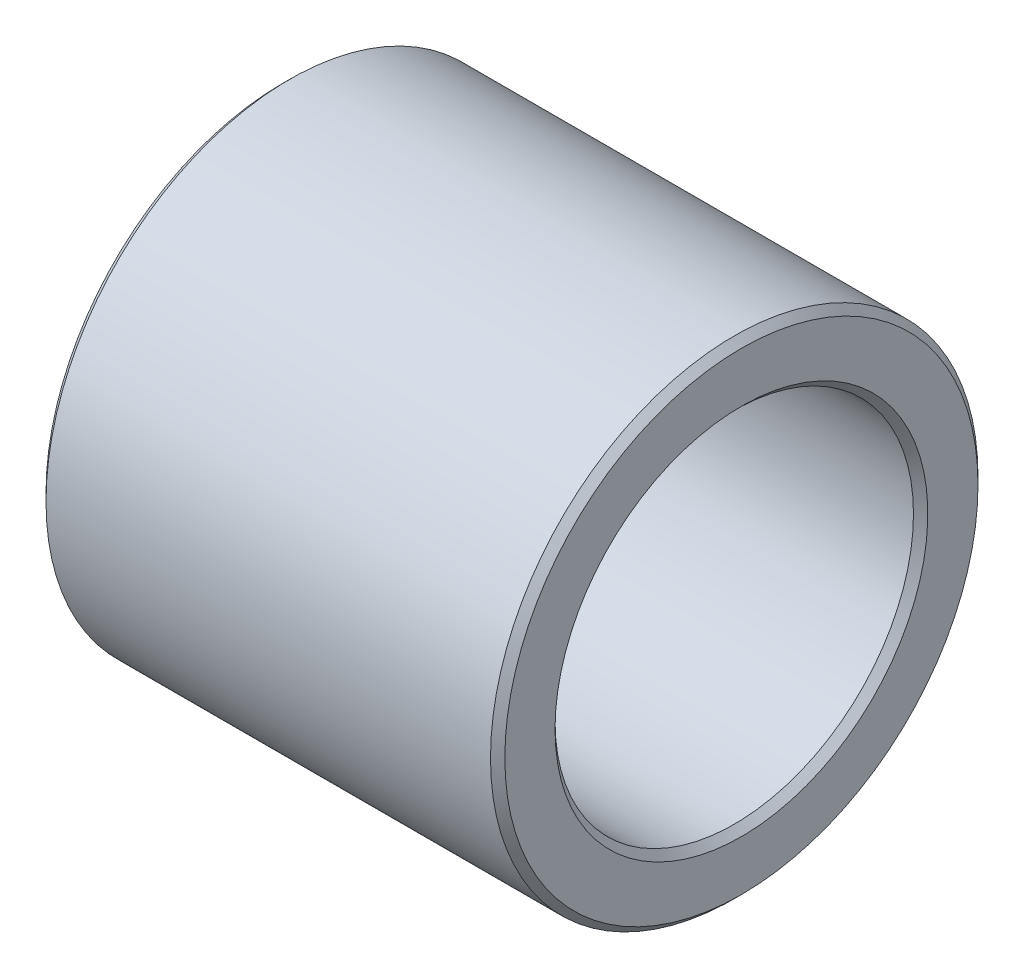
ISO-10303-21;
HEADER;
FILE_DESCRIPTION(('STEP AP214'),'2;1');
FILE_NAME('part.step','',(''),(''),'','','');
FILE_SCHEMA(('AUTOMOTIVE_DESIGN { 1 0 10303 214 1 1 1 1 }'));
ENDSEC;
DATA;
#1=APPLICATION_CONTEXT('core data for automotive mechanical design processes');
#2=APPLICATION_PROTOCOL_DEFINITION('international standard','automotive_design',2000,#1);
#3=PRODUCT_CONTEXT('',#1,'mechanical');
#4=PRODUCT('Part','Part','',(#3));
#5=PRODUCT_RELATED_PRODUCT_CATEGORY('part','',(#4));
#6=PRODUCT_DEFINITION_FORMATION('','',#4);
#7=PRODUCT_DEFINITION_CONTEXT('part definition',#1,'design');
#8=PRODUCT_DEFINITION('design','',#6,#7);
#9=PRODUCT_DEFINITION_SHAPE('','',#8);
#10=(LENGTH_UNIT() NAMED_UNIT(*) SI_UNIT(.MILLI.,.METRE.));
#11=(NAMED_UNIT(*) PLANE_ANGLE_UNIT() SI_UNIT($,.RADIAN.));
#12=(NAMED_UNIT(*) SI_UNIT($,.STERADIAN.) SOLID_ANGLE_UNIT());
#13=UNCERTAINTY_MEASURE_WITH_UNIT(LENGTH_MEASURE(1.E-05),#10,'distance_accuracy_value','');
#14=(GEOMETRIC_REPRESENTATION_CONTEXT(3) GLOBAL_UNCERTAINTY_ASSIGNED_CONTEXT((#13)) GLOBAL_UNIT_ASSIGNED_CONTEXT((#10,
#11,#12)) REPRESENTATION_CONTEXT('',''));
#15=CARTESIAN_POINT('',(0.,0.,0.));
#16=DIRECTION('',(0.,0.,1.));
#17=DIRECTION('',(1.,0.,0.));
#18=AXIS2_PLACEMENT_3D('',#15,#16,#17);
#19=CARTESIAN_POINT('',(-16.,-17.,1.18710365520667E-13));
#20=DIRECTION('',(1.,0.,0.));
#21=DIRECTION('',(0.,0.,-1.));
#22=AXIS2_PLACEMENT_3D('',#19,#20,#21);
#23=PLANE('',#22);
#24=CARTESIAN_POINT('',(-16.,0.,0.));
#25=DIRECTION('',(1.,0.,0.));
#26=DIRECTION('',(0.,0.,-1.));
#27=AXIS2_PLACEMENT_3D('',#24,#25,#26);
#28=CIRCLE('',#27,13.);
#29=CARTESIAN_POINT('',(-16.,0.,-13.));
#30=VERTEX_POINT('',#29);
#31=EDGE_CURVE('E53',#30,#30,#28,.T.);
#32=ORIENTED_EDGE('',*,*,#31,.T.);
#33=EDGE_LOOP('',(#32));
#34=FACE_BOUND('',#33,.T.);
#35=CARTESIAN_POINT('',(-16.,0.,0.));
#36=DIRECTION('',(1.,0.,0.));
#37=DIRECTION('',(0.,0.,-1.));
#38=AXIS2_PLACEMENT_3D('',#35,#36,#37);
#39=CIRCLE('',#38,16.5);
#40=CARTESIAN_POINT('',(-16.,0.,-16.5));
#41=VERTEX_POINT('',#40);
#42=EDGE_CURVE('E56',#41,#41,#39,.F.);
#43=ORIENTED_EDGE('',*,*,#42,.T.);
#44=EDGE_LOOP('',(#43));
#45=FACE_BOUND('',#44,.T.);
#46=ADVANCED_FACE('F33',(#34,#45),#23,.F.);
#47=CARTESIAN_POINT('',(-15.2283606747402,0.,0.));
#48=DIRECTION('',(-1.,0.,0.));
#49=DIRECTION('',(0.,0.,1.));
#50=AXIS2_PLACEMENT_3D('',#47,#48,#49);
#51=CYLINDRICAL_SURFACE('',#50,12.5);
#52=CARTESIAN_POINT('',(-15.5,0.,0.));
#53=DIRECTION('',(1.,0.,0.));
#54=DIRECTION('',(0.,0.,-1.));
#55=AXIS2_PLACEMENT_3D('',#52,#53,#54);
#56=CIRCLE('',#55,12.5);
#57=CARTESIAN_POINT('',(-15.5,0.,-12.5));
#58=VERTEX_POINT('',#57);
#59=EDGE_CURVE('E59',#58,#58,#56,.F.);
#60=ORIENTED_EDGE('',*,*,#59,.T.);
#61=EDGE_LOOP('',(#60));
#62=FACE_BOUND('',#61,.T.);
#63=CARTESIAN_POINT('',(15.5,0.,0.));
#64=DIRECTION('',(-1.,0.,0.));
#65=DIRECTION('',(0.,0.,1.));
#66=AXIS2_PLACEMENT_3D('',#63,#64,#65);
#67=CIRCLE('',#66,12.5);
#68=CARTESIAN_POINT('',(15.5,0.,12.5));
#69=VERTEX_POINT('',#68);
#70=EDGE_CURVE('E62',#69,#69,#67,.F.);
#71=ORIENTED_EDGE('',*,*,#70,.T.);
#72=EDGE_LOOP('',(#71));
#73=FACE_BOUND('',#72,.T.);
#74=ADVANCED_FACE('F66',(#62,#73),#51,.F.);
#75=CARTESIAN_POINT('',(16.,-17.,1.18710365520667E-13));
#76=DIRECTION('',(-1.,0.,0.));
#77=DIRECTION('',(0.,0.,1.));
#78=AXIS2_PLACEMENT_3D('',#75,#76,#77);
#79=PLANE('',#78);
#80=CARTESIAN_POINT('',(16.,0.,0.));
#81=DIRECTION('',(-1.,0.,0.));
#82=DIRECTION('',(0.,0.,1.));
#83=AXIS2_PLACEMENT_3D('',#80,#81,#82);
#84=CIRCLE('',#83,16.5);
#85=CARTESIAN_POINT('',(16.,0.,16.5));
#86=VERTEX_POINT('',#85);
#87=EDGE_CURVE('E10',#86,#86,#84,.F.);
#88=ORIENTED_EDGE('',*,*,#87,.T.);
#89=EDGE_LOOP('',(#88));
#90=FACE_BOUND('',#89,.T.);
#91=CARTESIAN_POINT('',(16.,0.,0.));
#92=DIRECTION('',(-1.,0.,0.));
#93=DIRECTION('',(0.,0.,1.));
#94=AXIS2_PLACEMENT_3D('',#91,#92,#93);
#95=CIRCLE('',#94,13.);
#96=CARTESIAN_POINT('',(16.,0.,13.));
#97=VERTEX_POINT('',#96);
#98=EDGE_CURVE('E40',#97,#97,#95,.T.);
#99=ORIENTED_EDGE('',*,*,#98,.T.);
#100=EDGE_LOOP('',(#99));
#101=FACE_BOUND('',#100,.T.);
#102=ADVANCED_FACE('F82',(#90,#101),#79,.F.);
#103=CARTESIAN_POINT('',(-15.2283606747402,0.,0.));
#104=DIRECTION('',(-1.,0.,0.));
#105=DIRECTION('',(0.,0.,1.));
#106=AXIS2_PLACEMENT_3D('',#103,#104,#105);
#107=CYLINDRICAL_SURFACE('',#106,17.);
#108=CARTESIAN_POINT('',(-15.5,0.,0.));
#109=DIRECTION('',(1.,0.,0.));
#110=DIRECTION('',(0.,0.,-1.));
#111=AXIS2_PLACEMENT_3D('',#108,#109,#110);
#112=CIRCLE('',#111,17.);
#113=CARTESIAN_POINT('',(-15.5,0.,-17.));
#114=VERTEX_POINT('',#113);
#115=EDGE_CURVE('E44',#114,#114,#112,.T.);
#116=ORIENTED_EDGE('',*,*,#115,.T.);
#117=EDGE_LOOP('',(#116));
#118=FACE_BOUND('',#117,.T.);
#119=CARTESIAN_POINT('',(15.5,0.,0.));
#120=DIRECTION('',(-1.,0.,0.));
#121=DIRECTION('',(0.,0.,1.));
#122=AXIS2_PLACEMENT_3D('',#119,#120,#121);
#123=CIRCLE('',#122,17.);
#124=CARTESIAN_POINT('',(15.5,0.,17.));
#125=VERTEX_POINT('',#124);
#126=EDGE_CURVE('E48',#125,#125,#123,.T.);
#127=ORIENTED_EDGE('',*,*,#126,.T.);
#128=EDGE_LOOP('',(#127));
#129=FACE_BOUND('',#128,.T.);
#130=ADVANCED_FACE('F91',(#118,#129),#107,.T.);
#131=CARTESIAN_POINT('',(-15.5,0.,0.));
#132=DIRECTION('',(-1.,0.,0.));
#133=DIRECTION('',(0.,0.,1.));
#134=AXIS2_PLACEMENT_3D('',#131,#132,#133);
#135=CONICAL_SURFACE('',#134,12.5,0.785398163397457);
#136=ORIENTED_EDGE('',*,*,#31,.F.);
#137=EDGE_LOOP('',(#136));
#138=FACE_BOUND('',#137,.T.);
#139=ORIENTED_EDGE('',*,*,#59,.F.);
#140=EDGE_LOOP('',(#139));
#141=FACE_BOUND('',#140,.T.);
#142=ADVANCED_FACE('F88',(#138,#141),#135,.F.);
#143=CARTESIAN_POINT('',(-16.,0.,0.));
#144=DIRECTION('',(1.,0.,0.));
#145=DIRECTION('',(0.,0.,-1.));
#146=AXIS2_PLACEMENT_3D('',#143,#144,#145);
#147=CONICAL_SURFACE('',#146,16.5,0.785398163397441);
#148=ORIENTED_EDGE('',*,*,#115,.F.);
#149=EDGE_LOOP('',(#148));
#150=FACE_BOUND('',#149,.T.);
#151=ORIENTED_EDGE('',*,*,#42,.F.);
#152=EDGE_LOOP('',(#151));
#153=FACE_BOUND('',#152,.T.);
#154=ADVANCED_FACE('F74',(#150,#153),#147,.T.);
#155=CARTESIAN_POINT('',(15.5,0.,0.));
#156=DIRECTION('',(-1.,0.,0.));
#157=DIRECTION('',(0.,0.,1.));
#158=AXIS2_PLACEMENT_3D('',#155,#156,#157);
#159=CONICAL_SURFACE('',#158,17.,0.785398163397455);
#160=ORIENTED_EDGE('',*,*,#87,.F.);
#161=EDGE_LOOP('',(#160));
#162=FACE_BOUND('',#161,.T.);
#163=ORIENTED_EDGE('',*,*,#126,.F.);
#164=EDGE_LOOP('',(#163));
#165=FACE_BOUND('',#164,.T.);
#166=ADVANCED_FACE('F70',(#162,#165),#159,.T.);
#167=CARTESIAN_POINT('',(16.,0.,0.));
#168=DIRECTION('',(1.,0.,0.));
#169=DIRECTION('',(0.,0.,-1.));
#170=AXIS2_PLACEMENT_3D('',#167,#168,#169);
#171=CONICAL_SURFACE('',#170,13.,0.785398163397452);
#172=ORIENTED_EDGE('',*,*,#70,.F.);
#173=EDGE_LOOP('',(#172));
#174=FACE_BOUND('',#173,.T.);
#175=ORIENTED_EDGE('',*,*,#98,.F.);
#176=EDGE_LOOP('',(#175));
#177=FACE_BOUND('',#176,.T.);
#178=ADVANCED_FACE('F35',(#174,#177),#171,.F.);
#179=CLOSED_SHELL('',(#46,#74,#102,#130,#142,#154,#166,#178));
#180=MANIFOLD_SOLID_BREP('B2',#179);
#181=ADVANCED_BREP_SHAPE_REPRESENTATION('',(#18,#180),#14);
#182=SHAPE_DEFINITION_REPRESENTATION(#9,#181);
ENDSEC;
END-ISO-10303-21;
